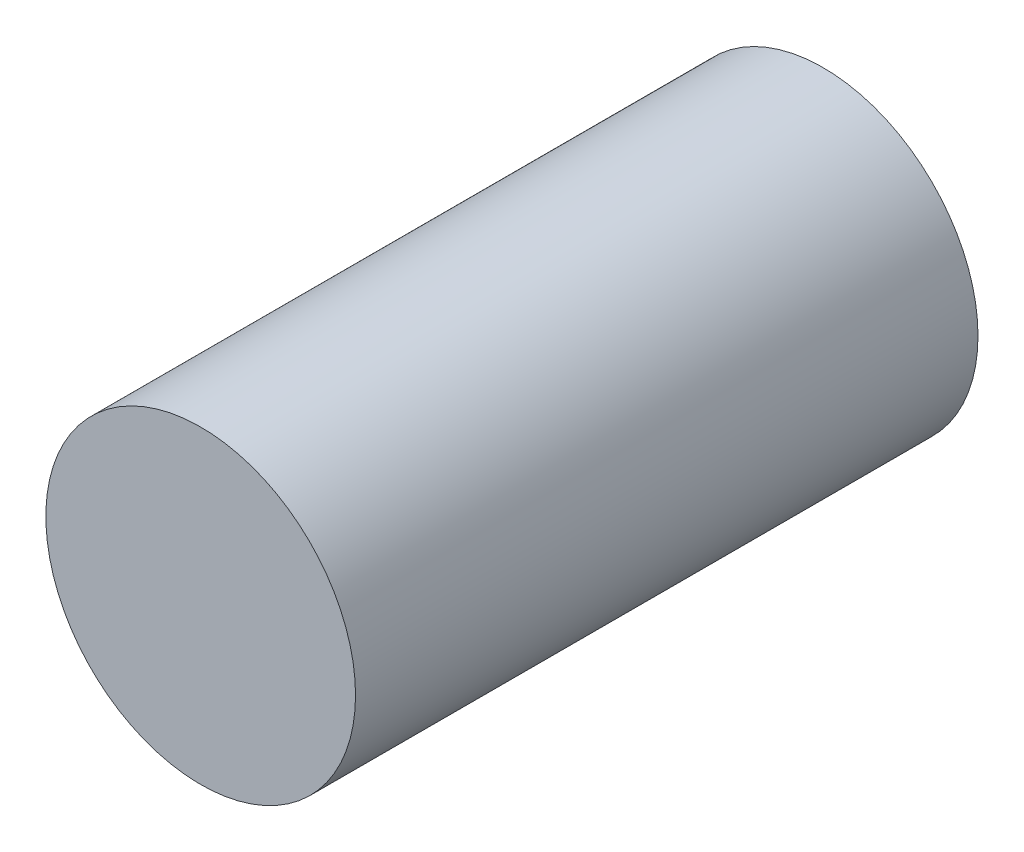
ISO-10303-21;
HEADER;
FILE_DESCRIPTION(('STEP AP214'),'2;1');
FILE_NAME('part.step','',(''),(''),'','','');
FILE_SCHEMA(('AUTOMOTIVE_DESIGN { 1 0 10303 214 1 1 1 1 }'));
ENDSEC;
DATA;
#1=APPLICATION_CONTEXT('core data for automotive mechanical design processes');
#2=APPLICATION_PROTOCOL_DEFINITION('international standard','automotive_design',2000,#1);
#3=PRODUCT_CONTEXT('',#1,'mechanical');
#4=PRODUCT('Part','Part','',(#3));
#5=PRODUCT_RELATED_PRODUCT_CATEGORY('part','',(#4));
#6=PRODUCT_DEFINITION_FORMATION('','',#4);
#7=PRODUCT_DEFINITION_CONTEXT('part definition',#1,'design');
#8=PRODUCT_DEFINITION('design','',#6,#7);
#9=PRODUCT_DEFINITION_SHAPE('','',#8);
#10=(LENGTH_UNIT() NAMED_UNIT(*) SI_UNIT(.MILLI.,.METRE.));
#11=(NAMED_UNIT(*) PLANE_ANGLE_UNIT() SI_UNIT($,.RADIAN.));
#12=(NAMED_UNIT(*) SI_UNIT($,.STERADIAN.) SOLID_ANGLE_UNIT());
#13=UNCERTAINTY_MEASURE_WITH_UNIT(LENGTH_MEASURE(1.E-05),#10,'distance_accuracy_value','');
#14=(GEOMETRIC_REPRESENTATION_CONTEXT(3) GLOBAL_UNCERTAINTY_ASSIGNED_CONTEXT((#13)) GLOBAL_UNIT_ASSIGNED_CONTEXT((#10,
#11,#12)) REPRESENTATION_CONTEXT('',''));
#15=CARTESIAN_POINT('',(0.,0.,0.));
#16=DIRECTION('',(0.,0.,1.));
#17=DIRECTION('',(1.,0.,0.));
#18=AXIS2_PLACEMENT_3D('',#15,#16,#17);
#19=CARTESIAN_POINT('',(0.,0.,0.));
#20=DIRECTION('',(0.,0.,-1.));
#21=DIRECTION('',(1.,0.,0.));
#22=AXIS2_PLACEMENT_3D('',#19,#20,#21);
#23=CYLINDRICAL_SURFACE('',#22,0.499999);
#24=CARTESIAN_POINT('',(0.,0.,0.));
#25=DIRECTION('',(0.,0.,1.));
#26=DIRECTION('',(1.,0.,0.));
#27=AXIS2_PLACEMENT_3D('',#24,#25,#26);
#28=CIRCLE('',#27,0.499999);
#29=CARTESIAN_POINT('',(0.499999,0.,0.));
#30=VERTEX_POINT('',#29);
#31=EDGE_CURVE('E11',#30,#30,#28,.T.);
#32=ORIENTED_EDGE('',*,*,#31,.T.);
#33=DIRECTION('',(0.,0.,1.));
#34=VECTOR('',#33,1.);
#35=CARTESIAN_POINT('',(0.499999,0.,0.));
#36=LINE('',#35,#34);
#37=CARTESIAN_POINT('',(0.499999,0.,2.01000106));
#38=VERTEX_POINT('',#37);
#39=EDGE_CURVE('E24',#30,#38,#36,.T.);
#40=ORIENTED_EDGE('',*,*,#39,.T.);
#41=CARTESIAN_POINT('',(0.,0.,2.01000106));
#42=DIRECTION('',(0.,0.,1.));
#43=DIRECTION('',(1.,0.,0.));
#44=AXIS2_PLACEMENT_3D('',#41,#42,#43);
#45=CIRCLE('',#44,0.499999);
#46=EDGE_CURVE('E32',#38,#38,#45,.T.);
#47=ORIENTED_EDGE('',*,*,#46,.F.);
#48=ORIENTED_EDGE('',*,*,#39,.F.);
#49=EDGE_LOOP('',(#32,#40,#47,#48));
#50=FACE_BOUND('',#49,.T.);
#51=ADVANCED_FACE('F17',(#50),#23,.T.);
#52=CARTESIAN_POINT('',(0.499999,0.,0.));
#53=DIRECTION('',(0.,0.,-1.));
#54=DIRECTION('',(-1.,0.,0.));
#55=AXIS2_PLACEMENT_3D('',#52,#53,#54);
#56=PLANE('',#55);
#57=ORIENTED_EDGE('',*,*,#31,.F.);
#58=EDGE_LOOP('',(#57));
#59=FACE_BOUND('',#58,.T.);
#60=ADVANCED_FACE('F37',(#59),#56,.T.);
#61=CARTESIAN_POINT('',(0.499999,0.,2.01000106));
#62=DIRECTION('',(0.,0.,-1.));
#63=DIRECTION('',(-1.,0.,0.));
#64=AXIS2_PLACEMENT_3D('',#61,#62,#63);
#65=PLANE('',#64);
#66=ORIENTED_EDGE('',*,*,#46,.T.);
#67=EDGE_LOOP('',(#66));
#68=FACE_BOUND('',#67,.T.);
#69=ADVANCED_FACE('F34',(#68),#65,.F.);
#70=CLOSED_SHELL('',(#51,#60,#69));
#71=MANIFOLD_SOLID_BREP('B1',#70);
#72=ADVANCED_BREP_SHAPE_REPRESENTATION('',(#18,#71),#14);
#73=SHAPE_DEFINITION_REPRESENTATION(#9,#72);
ENDSEC;
END-ISO-10303-21;
